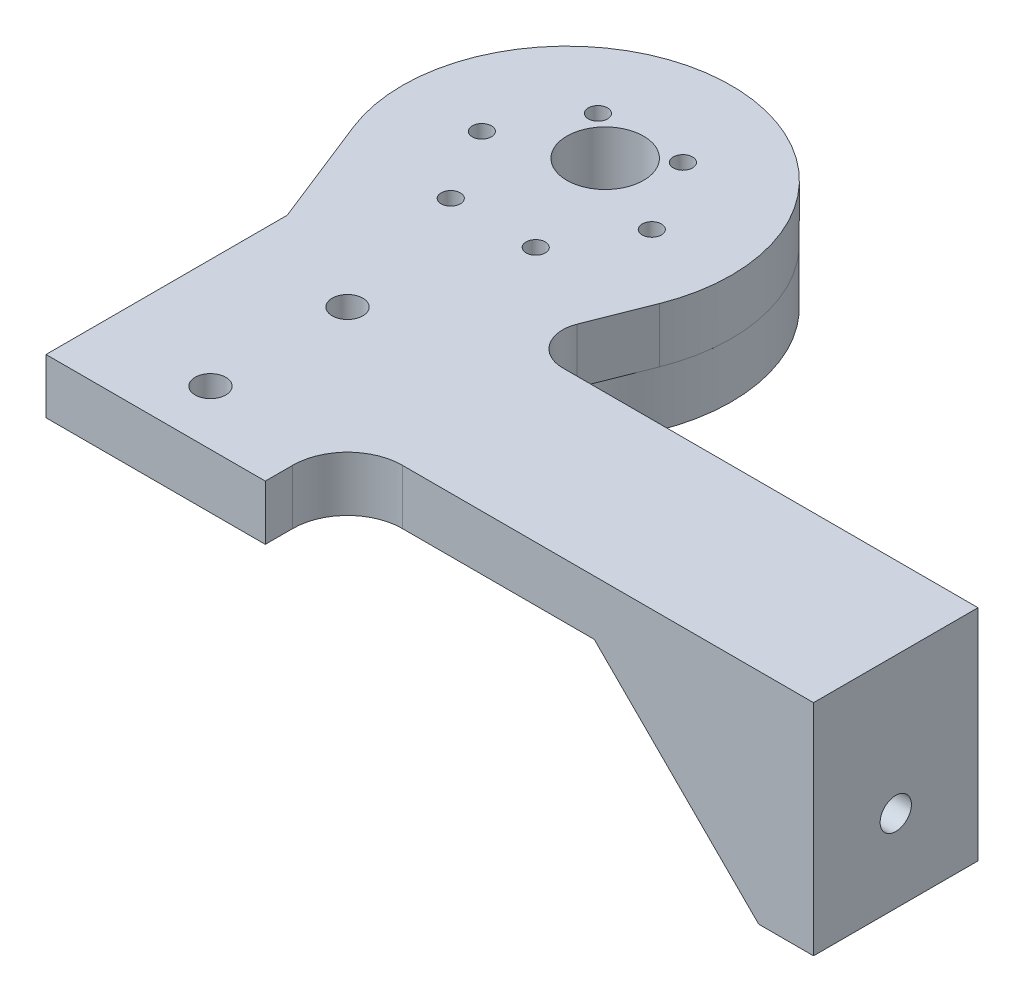
ISO-10303-21;
HEADER;
FILE_DESCRIPTION(('STEP AP214'),'2;1');
FILE_NAME('part.step','',(''),(''),'','','');
FILE_SCHEMA(('AUTOMOTIVE_DESIGN { 1 0 10303 214 1 1 1 1 }'));
ENDSEC;
DATA;
#1=APPLICATION_CONTEXT('core data for automotive mechanical design processes');
#2=APPLICATION_PROTOCOL_DEFINITION('international standard','automotive_design',2000,#1);
#3=PRODUCT_CONTEXT('',#1,'mechanical');
#4=PRODUCT('Part','Part','',(#3));
#5=PRODUCT_RELATED_PRODUCT_CATEGORY('part','',(#4));
#6=PRODUCT_DEFINITION_FORMATION('','',#4);
#7=PRODUCT_DEFINITION_CONTEXT('part definition',#1,'design');
#8=PRODUCT_DEFINITION('design','',#6,#7);
#9=PRODUCT_DEFINITION_SHAPE('','',#8);
#10=(LENGTH_UNIT() NAMED_UNIT(*) SI_UNIT(.MILLI.,.METRE.));
#11=(NAMED_UNIT(*) PLANE_ANGLE_UNIT() SI_UNIT($,.RADIAN.));
#12=(NAMED_UNIT(*) SI_UNIT($,.STERADIAN.) SOLID_ANGLE_UNIT());
#13=UNCERTAINTY_MEASURE_WITH_UNIT(LENGTH_MEASURE(1.E-05),#10,'distance_accuracy_value','');
#14=(GEOMETRIC_REPRESENTATION_CONTEXT(3) GLOBAL_UNCERTAINTY_ASSIGNED_CONTEXT((#13)) GLOBAL_UNIT_ASSIGNED_CONTEXT((#10,
#11,#12)) REPRESENTATION_CONTEXT('',''));
#15=CARTESIAN_POINT('',(0.,0.,0.));
#16=DIRECTION('',(0.,0.,1.));
#17=DIRECTION('',(1.,0.,0.));
#18=AXIS2_PLACEMENT_3D('',#15,#16,#17);
#19=CARTESIAN_POINT('',(0.,0.,0.));
#20=DIRECTION('',(0.,1.,0.));
#21=DIRECTION('',(0.,0.,1.));
#22=AXIS2_PLACEMENT_3D('',#19,#20,#21);
#23=PLANE('',#22);
#24=CARTESIAN_POINT('',(0.,0.,29.));
#25=DIRECTION('',(0.,1.,0.));
#26=DIRECTION('',(0.,0.,1.));
#27=AXIS2_PLACEMENT_3D('',#24,#25,#26);
#28=CIRCLE('',#27,5.3);
#29=CARTESIAN_POINT('',(0.,0.,34.3));
#30=VERTEX_POINT('',#29);
#31=EDGE_CURVE('E50',#30,#30,#28,.T.);
#32=ORIENTED_EDGE('',*,*,#31,.T.);
#33=EDGE_LOOP('',(#32));
#34=FACE_BOUND('',#33,.T.);
#35=CARTESIAN_POINT('',(0.,0.,4.));
#36=DIRECTION('',(0.,1.,0.));
#37=DIRECTION('',(0.,0.,1.));
#38=AXIS2_PLACEMENT_3D('',#35,#36,#37);
#39=CIRCLE('',#38,5.30000000000001);
#40=CARTESIAN_POINT('',(0.,0.,9.30000000000001));
#41=VERTEX_POINT('',#40);
#42=EDGE_CURVE('E465',#41,#41,#39,.T.);
#43=ORIENTED_EDGE('',*,*,#42,.T.);
#44=EDGE_LOOP('',(#43));
#45=FACE_BOUND('',#44,.T.);
#46=DIRECTION('',(0.,0.,1.));
#47=VECTOR('',#46,1.);
#48=CARTESIAN_POINT('',(65.,0.,19.));
#49=LINE('',#48,#47);
#50=CARTESIAN_POINT('',(65.,0.,19.));
#51=VERTEX_POINT('',#50);
#52=CARTESIAN_POINT('',(65.,0.,24.));
#53=VERTEX_POINT('',#52);
#54=EDGE_CURVE('E192',#51,#53,#49,.T.);
#55=ORIENTED_EDGE('',*,*,#54,.T.);
#56=DIRECTION('',(1.,0.,0.));
#57=VECTOR('',#56,1.);
#58=CARTESIAN_POINT('',(91.4644660940673,0.,24.));
#59=LINE('',#58,#57);
#60=CARTESIAN_POINT('',(30.,0.,24.));
#61=VERTEX_POINT('',#60);
#62=EDGE_CURVE('E587',#61,#53,#59,.T.);
#63=ORIENTED_EDGE('',*,*,#62,.F.);
#64=CARTESIAN_POINT('',(30.,0.,34.));
#65=DIRECTION('',(0.,1.,0.));
#66=DIRECTION('',(0.,0.,1.));
#67=AXIS2_PLACEMENT_3D('',#64,#65,#66);
#68=CIRCLE('',#67,10.);
#69=CARTESIAN_POINT('',(20.,0.,34.));
#70=VERTEX_POINT('',#69);
#71=EDGE_CURVE('E558',#61,#70,#68,.T.);
#72=ORIENTED_EDGE('',*,*,#71,.T.);
#73=DIRECTION('',(0.,0.,1.));
#74=VECTOR('',#73,1.);
#75=CARTESIAN_POINT('',(20.,0.,0.));
#76=LINE('',#75,#74);
#77=CARTESIAN_POINT('',(20.,0.,39.));
#78=VERTEX_POINT('',#77);
#79=EDGE_CURVE('E293',#70,#78,#76,.T.);
#80=ORIENTED_EDGE('',*,*,#79,.T.);
#81=DIRECTION('',(1.,0.,0.));
#82=VECTOR('',#81,1.);
#83=CARTESIAN_POINT('',(0.,0.,39.));
#84=LINE('',#83,#82);
#85=CARTESIAN_POINT('',(-20.,0.,39.));
#86=VERTEX_POINT('',#85);
#87=EDGE_CURVE('E290',#86,#78,#84,.T.);
#88=ORIENTED_EDGE('',*,*,#87,.F.);
#89=DIRECTION('',(0.,0.,1.));
#90=VECTOR('',#89,1.);
#91=CARTESIAN_POINT('',(-20.,0.,0.));
#92=LINE('',#91,#90);
#93=CARTESIAN_POINT('',(-20.,0.,-4.99999999999999));
#94=VERTEX_POINT('',#93);
#95=EDGE_CURVE('E287',#94,#86,#92,.T.);
#96=ORIENTED_EDGE('',*,*,#95,.F.);
#97=DIRECTION('',(0.367810603399802,0.,0.929900725898563));
#98=VECTOR('',#97,1.);
#99=CARTESIAN_POINT('',(-15.5841704650602,0.,6.16412374202665));
#100=LINE('',#99,#98);
#101=CARTESIAN_POINT('',(-27.881168443412,0.,-24.9252120213934));
#102=VERTEX_POINT('',#101);
#103=EDGE_CURVE('E288',#102,#94,#100,.T.);
#104=ORIENTED_EDGE('',*,*,#103,.F.);
#105=CARTESIAN_POINT('',(-0.000109724846624294,0.,-35.9998029723905));
#106=DIRECTION('',(0.,-1.,0.));
#107=DIRECTION('',(0.,0.,-1.));
#108=AXIS2_PLACEMENT_3D('',#105,#106,#107);
#109=CIRCLE('',#108,30.);
#110=CARTESIAN_POINT('',(27.8716982193593,0.,-24.9019508414015));
#111=VERTEX_POINT('',#110);
#112=EDGE_CURVE('E226',#111,#102,#109,.T.);
#113=ORIENTED_EDGE('',*,*,#112,.F.);
#114=DIRECTION('',(-0.367810603399802,0.,0.929900725898563));
#115=VECTOR('',#114,1.);
#116=CARTESIAN_POINT('',(15.5839373765418,0.,6.16403154677807));
#117=LINE('',#116,#115);
#118=CARTESIAN_POINT('',(23.641390214847,0.,-14.2068636203988));
#119=VERTEX_POINT('',#118);
#120=EDGE_CURVE('E295',#111,#119,#117,.T.);
#121=ORIENTED_EDGE('',*,*,#120,.T.);
#122=CARTESIAN_POINT('',(29.2207945702384,0.,-12.));
#123=DIRECTION('',(0.,1.,0.));
#124=DIRECTION('',(0.,0.,1.));
#125=AXIS2_PLACEMENT_3D('',#122,#123,#124);
#126=CIRCLE('',#125,6.);
#127=CARTESIAN_POINT('',(29.2207945702384,0.,-6.));
#128=VERTEX_POINT('',#127);
#129=EDGE_CURVE('E460',#119,#128,#126,.T.);
#130=ORIENTED_EDGE('',*,*,#129,.T.);
#131=DIRECTION('',(1.,0.,0.));
#132=VECTOR('',#131,1.);
#133=CARTESIAN_POINT('',(91.4644660940673,0.,-6.));
#134=LINE('',#133,#132);
#135=CARTESIAN_POINT('',(65.,0.,-6.));
#136=VERTEX_POINT('',#135);
#137=EDGE_CURVE('E576',#128,#136,#134,.T.);
#138=ORIENTED_EDGE('',*,*,#137,.T.);
#139=DIRECTION('',(0.,0.,-1.));
#140=VECTOR('',#139,1.);
#141=CARTESIAN_POINT('',(65.,0.,-0.999999999999998));
#142=LINE('',#141,#140);
#143=CARTESIAN_POINT('',(65.,0.,-0.999999999999998));
#144=VERTEX_POINT('',#143);
#145=EDGE_CURVE('E57',#144,#136,#142,.T.);
#146=ORIENTED_EDGE('',*,*,#145,.F.);
#147=DIRECTION('',(1.,0.,0.));
#148=VECTOR('',#147,1.);
#149=CARTESIAN_POINT('',(95.,1.03649727689614E-13,-0.999999999999998));
#150=LINE('',#149,#148);
#151=CARTESIAN_POINT('',(91.4644660940673,0.,-0.999999999999997));
#152=VERTEX_POINT('',#151);
#153=EDGE_CURVE('E619',#144,#152,#150,.T.);
#154=ORIENTED_EDGE('',*,*,#153,.T.);
#155=DIRECTION('',(0.,0.,-1.));
#156=VECTOR('',#155,1.);
#157=CARTESIAN_POINT('',(91.4644660940673,0.,24.));
#158=LINE('',#157,#156);
#159=CARTESIAN_POINT('',(91.4644660940672,0.,19.));
#160=VERTEX_POINT('',#159);
#161=EDGE_CURVE('E65',#160,#152,#158,.T.);
#162=ORIENTED_EDGE('',*,*,#161,.F.);
#163=DIRECTION('',(1.,0.,0.));
#164=VECTOR('',#163,1.);
#165=CARTESIAN_POINT('',(95.,1.03649727689614E-13,19.));
#166=LINE('',#165,#164);
#167=EDGE_CURVE('E183',#51,#160,#166,.T.);
#168=ORIENTED_EDGE('',*,*,#167,.F.);
#169=EDGE_LOOP('',(#55,#63,#72,#80,#88,#96,#104,#113,#121,#130,#138,#146,#154,#162,#168));
#170=FACE_BOUND('',#169,.T.);
#171=ADVANCED_FACE('F41',(#34,#45,#170),#23,.F.);
#172=CARTESIAN_POINT('',(20.,10.,0.));
#173=DIRECTION('',(1.,0.,0.));
#174=DIRECTION('',(0.,0.,-1.));
#175=AXIS2_PLACEMENT_3D('',#172,#173,#174);
#176=PLANE('',#175);
#177=ORIENTED_EDGE('',*,*,#79,.F.);
#178=DIRECTION('',(0.,-1.,0.));
#179=VECTOR('',#178,1.);
#180=CARTESIAN_POINT('',(20.,10.,34.));
#181=LINE('',#180,#179);
#182=CARTESIAN_POINT('',(20.,10.,34.));
#183=VERTEX_POINT('',#182);
#184=EDGE_CURVE('E561',#70,#183,#181,.F.);
#185=ORIENTED_EDGE('',*,*,#184,.T.);
#186=DIRECTION('',(0.,0.,1.));
#187=VECTOR('',#186,1.);
#188=CARTESIAN_POINT('',(20.,10.,0.));
#189=LINE('',#188,#187);
#190=CARTESIAN_POINT('',(20.,10.,39.));
#191=VERTEX_POINT('',#190);
#192=EDGE_CURVE('E251',#183,#191,#189,.T.);
#193=ORIENTED_EDGE('',*,*,#192,.T.);
#194=DIRECTION('',(0.,-1.,0.));
#195=VECTOR('',#194,1.);
#196=CARTESIAN_POINT('',(20.,10.,39.));
#197=LINE('',#196,#195);
#198=EDGE_CURVE('E320',#191,#78,#197,.T.);
#199=ORIENTED_EDGE('',*,*,#198,.T.);
#200=EDGE_LOOP('',(#177,#185,#193,#199));
#201=FACE_BOUND('',#200,.T.);
#202=ADVANCED_FACE('F382',(#201),#176,.T.);
#203=CARTESIAN_POINT('',(0.,0.,-42.9998029715306));
#204=DIRECTION('',(0.,1.,0.));
#205=DIRECTION('',(0.,0.,1.));
#206=AXIS2_PLACEMENT_3D('',#203,#204,#205);
#207=CIRCLE('',#206,7.);
#208=CARTESIAN_POINT('',(0.,0.,-35.9998029715306));
#209=VERTEX_POINT('',#208);
#210=EDGE_CURVE('E244',#209,#209,#207,.T.);
#211=ORIENTED_EDGE('',*,*,#210,.T.);
#212=EDGE_LOOP('',(#211));
#213=FACE_BOUND('',#212,.T.);
#214=CARTESIAN_POINT('',(15.4999268338223,0.,-35.999990172644));
#215=DIRECTION('',(0.,1.,0.));
#216=DIRECTION('',(0.,0.,1.));
#217=AXIS2_PLACEMENT_3D('',#214,#215,#216);
#218=CIRCLE('',#217,1.74999999984744);
#219=CARTESIAN_POINT('',(15.4999268338223,0.,-34.2499901727966));
#220=VERTEX_POINT('',#219);
#221=EDGE_CURVE('E314',#220,#220,#218,.T.);
#222=ORIENTED_EDGE('',*,*,#221,.T.);
#223=EDGE_LOOP('',(#222));
#224=FACE_BOUND('',#223,.T.);
#225=CARTESIAN_POINT('',(7.74993934954525,0.,-22.576589188037));
#226=DIRECTION('',(0.,1.,0.));
#227=DIRECTION('',(0.,0.,1.));
#228=AXIS2_PLACEMENT_3D('',#225,#226,#227);
#229=CIRCLE('',#228,1.74999999984744);
#230=CARTESIAN_POINT('',(7.74993934954525,0.,-20.8265891881896));
#231=VERTEX_POINT('',#230);
#232=EDGE_CURVE('E311',#231,#231,#229,.T.);
#233=ORIENTED_EDGE('',*,*,#232,.T.);
#234=EDGE_LOOP('',(#233));
#235=FACE_BOUND('',#234,.T.);
#236=CARTESIAN_POINT('',(-7.75006065044802,0.,-22.5765747361289));
#237=DIRECTION('',(0.,1.,0.));
#238=DIRECTION('',(0.,0.,1.));
#239=AXIS2_PLACEMENT_3D('',#236,#237,#238);
#240=CIRCLE('',#239,1.74999999984744);
#241=CARTESIAN_POINT('',(-7.75006065044802,0.,-20.8265747362815));
#242=VERTEX_POINT('',#241);
#243=EDGE_CURVE('E308',#242,#242,#240,.T.);
#244=ORIENTED_EDGE('',*,*,#243,.T.);
#245=EDGE_LOOP('',(#244));
#246=FACE_BOUND('',#245,.T.);
#247=CARTESIAN_POINT('',(-15.5000731661642,0.,-35.9999612688279));
#248=DIRECTION('',(0.,1.,0.));
#249=DIRECTION('',(0.,0.,1.));
#250=AXIS2_PLACEMENT_3D('',#247,#248,#249);
#251=CIRCLE('',#250,1.74999999984744);
#252=CARTESIAN_POINT('',(-15.5000731661642,0.,-34.2499612689804));
#253=VERTEX_POINT('',#252);
#254=EDGE_CURVE('E305',#253,#253,#251,.T.);
#255=ORIENTED_EDGE('',*,*,#254,.T.);
#256=EDGE_LOOP('',(#255));
#257=FACE_BOUND('',#256,.T.);
#258=CARTESIAN_POINT('',(-7.75008568188708,0.,-49.4233622534349));
#259=DIRECTION('',(0.,1.,0.));
#260=DIRECTION('',(0.,0.,1.));
#261=AXIS2_PLACEMENT_3D('',#258,#259,#260);
#262=CIRCLE('',#261,1.74999999984745);
#263=CARTESIAN_POINT('',(-7.75008568188708,0.,-47.6733622535874));
#264=VERTEX_POINT('',#263);
#265=EDGE_CURVE('E302',#264,#264,#262,.T.);
#266=ORIENTED_EDGE('',*,*,#265,.T.);
#267=EDGE_LOOP('',(#266));
#268=FACE_BOUND('',#267,.T.);
#269=CARTESIAN_POINT('',(7.74991431810619,0.,-49.423376705343));
#270=DIRECTION('',(0.,1.,0.));
#271=DIRECTION('',(0.,0.,1.));
#272=AXIS2_PLACEMENT_3D('',#269,#270,#271);
#273=CIRCLE('',#272,1.74999999984744);
#274=CARTESIAN_POINT('',(7.74991431810619,0.,-47.6733767054955));
#275=VERTEX_POINT('',#274);
#276=EDGE_CURVE('E299',#275,#275,#273,.T.);
#277=ORIENTED_EDGE('',*,*,#276,.T.);
#278=EDGE_LOOP('',(#277));
#279=FACE_BOUND('',#278,.T.);
#280=CARTESIAN_POINT('',(-0.000109724846624294,0.,-35.9998029723905));
#281=DIRECTION('',(0.,-1.,0.));
#282=DIRECTION('',(0.,0.,-1.));
#283=AXIS2_PLACEMENT_3D('',#280,#281,#282);
#284=CIRCLE('',#283,18.7);
#285=CARTESIAN_POINT('',(-0.000109724846624294,0.,-54.6998029723906));
#286=VERTEX_POINT('',#285);
#287=EDGE_CURVE('E214',#286,#286,#284,.T.);
#288=ORIENTED_EDGE('',*,*,#287,.T.);
#289=EDGE_LOOP('',(#288));
#290=FACE_BOUND('',#289,.T.);
#291=ADVANCED_FACE('F356',(#213,#224,#235,#246,#257,#268,#279,#290),#23,.F.);
#292=CARTESIAN_POINT('',(-0.000134777597993532,10.,-35.9999513511064));
#293=DIRECTION('',(0.,-1.,0.));
#294=DIRECTION('',(0.,0.,-1.));
#295=AXIS2_PLACEMENT_3D('',#292,#293,#294);
#296=CYLINDRICAL_SURFACE('',#295,30.);
#297=CARTESIAN_POINT('',(-0.000134777597993532,0.,-35.9999513511064));
#298=DIRECTION('',(0.,1.,0.));
#299=DIRECTION('',(0.,0.,1.));
#300=AXIS2_PLACEMENT_3D('',#297,#298,#299);
#301=CIRCLE('',#300,30.);
#302=CARTESIAN_POINT('',(-27.8971565545549,0.,-24.9656332491124));
#303=VERTEX_POINT('',#302);
#304=CARTESIAN_POINT('',(-29.5814324307801,0.,-31.0052712658716));
#305=VERTEX_POINT('',#304);
#306=EDGE_CURVE('E331',#303,#305,#301,.F.);
#307=ORIENTED_EDGE('',*,*,#306,.F.);
#308=DIRECTION('',(0.,-1.,0.));
#309=VECTOR('',#308,1.);
#310=CARTESIAN_POINT('',(-27.8971565545549,10.,-24.9656332491124));
#311=LINE('',#310,#309);
#312=CARTESIAN_POINT('',(-27.8971565545549,10.,-24.9656332491124));
#313=VERTEX_POINT('',#312);
#314=EDGE_CURVE('E329',#313,#303,#311,.T.);
#315=ORIENTED_EDGE('',*,*,#314,.F.);
#316=CARTESIAN_POINT('',(-0.000134777597993532,10.,-35.9999513511064));
#317=DIRECTION('',(0.,1.,0.));
#318=DIRECTION('',(0.,0.,1.));
#319=AXIS2_PLACEMENT_3D('',#316,#317,#318);
#320=CIRCLE('',#319,30.);
#321=CARTESIAN_POINT('',(27.8968869993589,10.,-24.9656332491124));
#322=VERTEX_POINT('',#321);
#323=EDGE_CURVE('E240',#313,#322,#320,.F.);
#324=ORIENTED_EDGE('',*,*,#323,.T.);
#325=DIRECTION('',(0.,-1.,0.));
#326=VECTOR('',#325,1.);
#327=CARTESIAN_POINT('',(27.8968869993589,10.,-24.9656332491124));
#328=LINE('',#327,#326);
#329=CARTESIAN_POINT('',(27.8968869993589,0.,-24.9656332491124));
#330=VERTEX_POINT('',#329);
#331=EDGE_CURVE('E283',#322,#330,#328,.T.);
#332=ORIENTED_EDGE('',*,*,#331,.T.);
#333=CARTESIAN_POINT('',(29.5811879285658,0.,-40.9944830562613));
#334=VERTEX_POINT('',#333);
#335=EDGE_CURVE('E224',#334,#330,#301,.F.);
#336=ORIENTED_EDGE('',*,*,#335,.F.);
#337=CARTESIAN_POINT('',(-0.000109724846624294,0.,-35.9998029723905));
#338=DIRECTION('',(0.,-1.,0.));
#339=DIRECTION('',(-0.986044090197783,0.,0.166484390217298));
#340=AXIS2_PLACEMENT_3D('',#337,#338,#339);
#341=CIRCLE('',#340,30.);
#342=EDGE_CURVE('E231',#305,#334,#341,.T.);
#343=ORIENTED_EDGE('',*,*,#342,.F.);
#344=EDGE_LOOP('',(#307,#315,#324,#332,#336,#343));
#345=FACE_BOUND('',#344,.T.);
#346=ADVANCED_FACE('F345',(#345),#296,.T.);
#347=CARTESIAN_POINT('',(-15.5841704650602,10.,6.16412374202665));
#348=DIRECTION('',(0.929900725898563,0.,-0.367810603399802));
#349=DIRECTION('',(-0.367810603399802,0.,-0.929900725898563));
#350=AXIS2_PLACEMENT_3D('',#347,#348,#349);
#351=PLANE('',#350);
#352=EDGE_CURVE('E284',#303,#102,#100,.T.);
#353=ORIENTED_EDGE('',*,*,#352,.T.);
#354=ORIENTED_EDGE('',*,*,#103,.T.);
#355=DIRECTION('',(0.,-1.,0.));
#356=VECTOR('',#355,1.);
#357=CARTESIAN_POINT('',(-20.,10.,-4.99999999999999));
#358=LINE('',#357,#356);
#359=CARTESIAN_POINT('',(-20.,10.,-4.99999999999999));
#360=VERTEX_POINT('',#359);
#361=EDGE_CURVE('E326',#360,#94,#358,.T.);
#362=ORIENTED_EDGE('',*,*,#361,.F.);
#363=DIRECTION('',(0.367810603399802,0.,0.929900725898563));
#364=VECTOR('',#363,1.);
#365=CARTESIAN_POINT('',(-15.5841704650602,10.,6.16412374202665));
#366=LINE('',#365,#364);
#367=EDGE_CURVE('E243',#313,#360,#366,.T.);
#368=ORIENTED_EDGE('',*,*,#367,.F.);
#369=ORIENTED_EDGE('',*,*,#314,.T.);
#370=EDGE_LOOP('',(#353,#354,#362,#368,#369));
#371=FACE_BOUND('',#370,.T.);
#372=ADVANCED_FACE('F355',(#371),#351,.F.);
#373=CARTESIAN_POINT('',(-20.,10.,0.));
#374=DIRECTION('',(1.,0.,0.));
#375=DIRECTION('',(0.,0.,-1.));
#376=AXIS2_PLACEMENT_3D('',#373,#374,#375);
#377=PLANE('',#376);
#378=ORIENTED_EDGE('',*,*,#95,.T.);
#379=DIRECTION('',(0.,-1.,0.));
#380=VECTOR('',#379,1.);
#381=CARTESIAN_POINT('',(-20.,10.,39.));
#382=LINE('',#381,#380);
#383=CARTESIAN_POINT('',(-20.,10.,39.));
#384=VERTEX_POINT('',#383);
#385=EDGE_CURVE('E323',#384,#86,#382,.T.);
#386=ORIENTED_EDGE('',*,*,#385,.F.);
#387=DIRECTION('',(0.,0.,1.));
#388=VECTOR('',#387,1.);
#389=CARTESIAN_POINT('',(-20.,10.,0.));
#390=LINE('',#389,#388);
#391=EDGE_CURVE('E246',#360,#384,#390,.T.);
#392=ORIENTED_EDGE('',*,*,#391,.F.);
#393=ORIENTED_EDGE('',*,*,#361,.T.);
#394=EDGE_LOOP('',(#378,#386,#392,#393));
#395=FACE_BOUND('',#394,.T.);
#396=ADVANCED_FACE('F541',(#395),#377,.F.);
#397=CARTESIAN_POINT('',(0.,10.,39.));
#398=DIRECTION('',(0.,0.,-1.));
#399=DIRECTION('',(-1.,0.,0.));
#400=AXIS2_PLACEMENT_3D('',#397,#398,#399);
#401=PLANE('',#400);
#402=ORIENTED_EDGE('',*,*,#87,.T.);
#403=ORIENTED_EDGE('',*,*,#198,.F.);
#404=DIRECTION('',(1.,0.,0.));
#405=VECTOR('',#404,1.);
#406=CARTESIAN_POINT('',(0.,10.,39.));
#407=LINE('',#406,#405);
#408=EDGE_CURVE('E248',#384,#191,#407,.T.);
#409=ORIENTED_EDGE('',*,*,#408,.F.);
#410=ORIENTED_EDGE('',*,*,#385,.T.);
#411=EDGE_LOOP('',(#402,#403,#409,#410));
#412=FACE_BOUND('',#411,.T.);
#413=ADVANCED_FACE('F516',(#412),#401,.F.);
#414=CARTESIAN_POINT('',(0.,10.,-42.9998029715306));
#415=DIRECTION('',(0.,-1.,0.));
#416=DIRECTION('',(0.,0.,-1.));
#417=AXIS2_PLACEMENT_3D('',#414,#415,#416);
#418=CYLINDRICAL_SURFACE('',#417,7.);
#419=CARTESIAN_POINT('',(0.,10.,-42.9998029715306));
#420=DIRECTION('',(0.,1.,0.));
#421=DIRECTION('',(0.,0.,1.));
#422=AXIS2_PLACEMENT_3D('',#419,#420,#421);
#423=CIRCLE('',#422,7.);
#424=CARTESIAN_POINT('',(0.,10.,-35.9998029715306));
#425=VERTEX_POINT('',#424);
#426=EDGE_CURVE('E277',#425,#425,#423,.T.);
#427=ORIENTED_EDGE('',*,*,#426,.T.);
#428=EDGE_LOOP('',(#427));
#429=FACE_BOUND('',#428,.T.);
#430=ORIENTED_EDGE('',*,*,#210,.F.);
#431=EDGE_LOOP('',(#430));
#432=FACE_BOUND('',#431,.T.);
#433=ADVANCED_FACE('F512',(#429,#432),#418,.F.);
#434=CARTESIAN_POINT('',(15.4999268338223,10.,-35.999990172644));
#435=DIRECTION('',(0.,-1.,0.));
#436=DIRECTION('',(0.,0.,-1.));
#437=AXIS2_PLACEMENT_3D('',#434,#435,#436);
#438=CYLINDRICAL_SURFACE('',#437,1.74999999984744);
#439=CARTESIAN_POINT('',(15.4999268338223,10.,-35.999990172644));
#440=DIRECTION('',(0.,1.,0.));
#441=DIRECTION('',(0.,0.,1.));
#442=AXIS2_PLACEMENT_3D('',#439,#440,#441);
#443=CIRCLE('',#442,1.74999999984744);
#444=CARTESIAN_POINT('',(15.4999268338223,10.,-34.2499901727966));
#445=VERTEX_POINT('',#444);
#446=EDGE_CURVE('E274',#445,#445,#443,.T.);
#447=ORIENTED_EDGE('',*,*,#446,.T.);
#448=EDGE_LOOP('',(#447));
#449=FACE_BOUND('',#448,.T.);
#450=ORIENTED_EDGE('',*,*,#221,.F.);
#451=EDGE_LOOP('',(#450));
#452=FACE_BOUND('',#451,.T.);
#453=ADVANCED_FACE('F515',(#449,#452),#438,.F.);
#454=CARTESIAN_POINT('',(7.74993934954525,10.,-22.576589188037));
#455=DIRECTION('',(0.,-1.,0.));
#456=DIRECTION('',(0.,0.,-1.));
#457=AXIS2_PLACEMENT_3D('',#454,#455,#456);
#458=CYLINDRICAL_SURFACE('',#457,1.74999999984744);
#459=CARTESIAN_POINT('',(7.74993934954525,10.,-22.576589188037));
#460=DIRECTION('',(0.,1.,0.));
#461=DIRECTION('',(0.,0.,1.));
#462=AXIS2_PLACEMENT_3D('',#459,#460,#461);
#463=CIRCLE('',#462,1.74999999984744);
#464=CARTESIAN_POINT('',(7.74993934954525,10.,-20.8265891881896));
#465=VERTEX_POINT('',#464);
#466=EDGE_CURVE('E271',#465,#465,#463,.T.);
#467=ORIENTED_EDGE('',*,*,#466,.T.);
#468=EDGE_LOOP('',(#467));
#469=FACE_BOUND('',#468,.T.);
#470=ORIENTED_EDGE('',*,*,#232,.F.);
#471=EDGE_LOOP('',(#470));
#472=FACE_BOUND('',#471,.T.);
#473=ADVANCED_FACE('F520',(#469,#472),#458,.F.);
#474=CARTESIAN_POINT('',(-7.75006065044802,10.,-22.5765747361289));
#475=DIRECTION('',(0.,-1.,0.));
#476=DIRECTION('',(0.,0.,-1.));
#477=AXIS2_PLACEMENT_3D('',#474,#475,#476);
#478=CYLINDRICAL_SURFACE('',#477,1.74999999984744);
#479=CARTESIAN_POINT('',(-7.75006065044802,10.,-22.5765747361289));
#480=DIRECTION('',(0.,1.,0.));
#481=DIRECTION('',(0.,0.,1.));
#482=AXIS2_PLACEMENT_3D('',#479,#480,#481);
#483=CIRCLE('',#482,1.74999999984744);
#484=CARTESIAN_POINT('',(-7.75006065044802,10.,-20.8265747362815));
#485=VERTEX_POINT('',#484);
#486=EDGE_CURVE('E268',#485,#485,#483,.T.);
#487=ORIENTED_EDGE('',*,*,#486,.T.);
#488=EDGE_LOOP('',(#487));
#489=FACE_BOUND('',#488,.T.);
#490=ORIENTED_EDGE('',*,*,#243,.F.);
#491=EDGE_LOOP('',(#490));
#492=FACE_BOUND('',#491,.T.);
#493=ADVANCED_FACE('F524',(#489,#492),#478,.F.);
#494=CARTESIAN_POINT('',(-15.5000731661642,10.,-35.9999612688279));
#495=DIRECTION('',(0.,-1.,0.));
#496=DIRECTION('',(0.,0.,-1.));
#497=AXIS2_PLACEMENT_3D('',#494,#495,#496);
#498=CYLINDRICAL_SURFACE('',#497,1.74999999984744);
#499=CARTESIAN_POINT('',(-15.5000731661642,10.,-35.9999612688279));
#500=DIRECTION('',(0.,1.,0.));
#501=DIRECTION('',(0.,0.,1.));
#502=AXIS2_PLACEMENT_3D('',#499,#500,#501);
#503=CIRCLE('',#502,1.74999999984744);
#504=CARTESIAN_POINT('',(-15.5000731661642,10.,-34.2499612689804));
#505=VERTEX_POINT('',#504);
#506=EDGE_CURVE('E265',#505,#505,#503,.T.);
#507=ORIENTED_EDGE('',*,*,#506,.T.);
#508=EDGE_LOOP('',(#507));
#509=FACE_BOUND('',#508,.T.);
#510=ORIENTED_EDGE('',*,*,#254,.F.);
#511=EDGE_LOOP('',(#510));
#512=FACE_BOUND('',#511,.T.);
#513=ADVANCED_FACE('F528',(#509,#512),#498,.F.);
#514=CARTESIAN_POINT('',(-7.75008568188708,10.,-49.4233622534349));
#515=DIRECTION('',(0.,-1.,0.));
#516=DIRECTION('',(0.,0.,-1.));
#517=AXIS2_PLACEMENT_3D('',#514,#515,#516);
#518=CYLINDRICAL_SURFACE('',#517,1.74999999984745);
#519=CARTESIAN_POINT('',(-7.75008568188708,10.,-49.4233622534349));
#520=DIRECTION('',(0.,1.,0.));
#521=DIRECTION('',(0.,0.,1.));
#522=AXIS2_PLACEMENT_3D('',#519,#520,#521);
#523=CIRCLE('',#522,1.74999999984745);
#524=CARTESIAN_POINT('',(-7.75008568188708,10.,-47.6733622535874));
#525=VERTEX_POINT('',#524);
#526=EDGE_CURVE('E262',#525,#525,#523,.T.);
#527=ORIENTED_EDGE('',*,*,#526,.T.);
#528=EDGE_LOOP('',(#527));
#529=FACE_BOUND('',#528,.T.);
#530=ORIENTED_EDGE('',*,*,#265,.F.);
#531=EDGE_LOOP('',(#530));
#532=FACE_BOUND('',#531,.T.);
#533=ADVANCED_FACE('F532',(#529,#532),#518,.F.);
#534=CARTESIAN_POINT('',(7.74991431810619,10.,-49.423376705343));
#535=DIRECTION('',(0.,-1.,0.));
#536=DIRECTION('',(0.,0.,-1.));
#537=AXIS2_PLACEMENT_3D('',#534,#535,#536);
#538=CYLINDRICAL_SURFACE('',#537,1.74999999984744);
#539=CARTESIAN_POINT('',(7.74991431810619,10.,-49.423376705343));
#540=DIRECTION('',(0.,1.,0.));
#541=DIRECTION('',(0.,0.,1.));
#542=AXIS2_PLACEMENT_3D('',#539,#540,#541);
#543=CIRCLE('',#542,1.74999999984744);
#544=CARTESIAN_POINT('',(7.74991431810619,10.,-47.6733767054955));
#545=VERTEX_POINT('',#544);
#546=EDGE_CURVE('E259',#545,#545,#543,.T.);
#547=ORIENTED_EDGE('',*,*,#546,.T.);
#548=EDGE_LOOP('',(#547));
#549=FACE_BOUND('',#548,.T.);
#550=ORIENTED_EDGE('',*,*,#276,.F.);
#551=EDGE_LOOP('',(#550));
#552=FACE_BOUND('',#551,.T.);
#553=ADVANCED_FACE('F481',(#549,#552),#538,.F.);
#554=CARTESIAN_POINT('',(0.,10.,4.));
#555=DIRECTION('',(0.,-1.,0.));
#556=DIRECTION('',(0.,0.,-1.));
#557=AXIS2_PLACEMENT_3D('',#554,#555,#556);
#558=CYLINDRICAL_SURFACE('',#557,2.8);
#559=CARTESIAN_POINT('',(0.,2.50000000000003,4.));
#560=DIRECTION('',(0.,1.,0.));
#561=DIRECTION('',(0.,0.,1.));
#562=AXIS2_PLACEMENT_3D('',#559,#560,#561);
#563=CIRCLE('',#562,2.8);
#564=CARTESIAN_POINT('',(0.,2.50000000000003,6.8));
#565=VERTEX_POINT('',#564);
#566=EDGE_CURVE('E469',#565,#565,#563,.F.);
#567=ORIENTED_EDGE('',*,*,#566,.T.);
#568=EDGE_LOOP('',(#567));
#569=FACE_BOUND('',#568,.T.);
#570=CARTESIAN_POINT('',(0.,10.,4.));
#571=DIRECTION('',(0.,1.,0.));
#572=DIRECTION('',(0.,0.,1.));
#573=AXIS2_PLACEMENT_3D('',#570,#571,#572);
#574=CIRCLE('',#573,2.8);
#575=CARTESIAN_POINT('',(0.,10.,6.8));
#576=VERTEX_POINT('',#575);
#577=EDGE_CURVE('E256',#576,#576,#574,.T.);
#578=ORIENTED_EDGE('',*,*,#577,.T.);
#579=EDGE_LOOP('',(#578));
#580=FACE_BOUND('',#579,.T.);
#581=ADVANCED_FACE('F478',(#569,#580),#558,.F.);
#582=CARTESIAN_POINT('',(15.5839373765418,10.,6.16403154677807));
#583=DIRECTION('',(0.929900725898563,0.,0.367810603399802));
#584=DIRECTION('',(0.367810603399802,0.,-0.929900725898563));
#585=AXIS2_PLACEMENT_3D('',#582,#583,#584);
#586=PLANE('',#585);
#587=DIRECTION('',(-0.367810603399802,0.,0.929900725898563));
#588=VECTOR('',#587,1.);
#589=CARTESIAN_POINT('',(15.5839373765418,10.,6.16403154677807));
#590=LINE('',#589,#588);
#591=CARTESIAN_POINT('',(23.641390214847,10.,-14.2068636203988));
#592=VERTEX_POINT('',#591);
#593=EDGE_CURVE('E253',#322,#592,#590,.T.);
#594=ORIENTED_EDGE('',*,*,#593,.T.);
#595=DIRECTION('',(0.,1.,0.));
#596=VECTOR('',#595,1.);
#597=CARTESIAN_POINT('',(23.641390214847,0.,-14.2068636203988));
#598=LINE('',#597,#596);
#599=EDGE_CURVE('E458',#592,#119,#598,.F.);
#600=ORIENTED_EDGE('',*,*,#599,.T.);
#601=ORIENTED_EDGE('',*,*,#120,.F.);
#602=EDGE_CURVE('E296',#330,#111,#117,.T.);
#603=ORIENTED_EDGE('',*,*,#602,.F.);
#604=ORIENTED_EDGE('',*,*,#331,.F.);
#605=EDGE_LOOP('',(#594,#600,#601,#603,#604));
#606=FACE_BOUND('',#605,.T.);
#607=ADVANCED_FACE('F455',(#606),#586,.T.);
#608=CARTESIAN_POINT('',(0.,10.,29.));
#609=DIRECTION('',(0.,-1.,0.));
#610=DIRECTION('',(0.,0.,-1.));
#611=AXIS2_PLACEMENT_3D('',#608,#609,#610);
#612=CYLINDRICAL_SURFACE('',#611,2.8);
#613=CARTESIAN_POINT('',(0.,2.50000000000001,29.));
#614=DIRECTION('',(0.,1.,0.));
#615=DIRECTION('',(0.,0.,1.));
#616=AXIS2_PLACEMENT_3D('',#613,#614,#615);
#617=CIRCLE('',#616,2.8);
#618=CARTESIAN_POINT('',(0.,2.50000000000001,31.8));
#619=VERTEX_POINT('',#618);
#620=EDGE_CURVE('E11',#619,#619,#617,.F.);
#621=ORIENTED_EDGE('',*,*,#620,.T.);
#622=EDGE_LOOP('',(#621));
#623=FACE_BOUND('',#622,.T.);
#624=CARTESIAN_POINT('',(0.,10.,29.));
#625=DIRECTION('',(0.,1.,0.));
#626=DIRECTION('',(0.,0.,1.));
#627=AXIS2_PLACEMENT_3D('',#624,#625,#626);
#628=CIRCLE('',#627,2.8);
#629=CARTESIAN_POINT('',(0.,10.,31.8));
#630=VERTEX_POINT('',#629);
#631=EDGE_CURVE('E280',#630,#630,#628,.T.);
#632=ORIENTED_EDGE('',*,*,#631,.T.);
#633=EDGE_LOOP('',(#632));
#634=FACE_BOUND('',#633,.T.);
#635=ADVANCED_FACE('F486',(#623,#634),#612,.F.);
#636=CARTESIAN_POINT('',(0.,10.,0.));
#637=DIRECTION('',(0.,1.,0.));
#638=DIRECTION('',(0.,0.,1.));
#639=AXIS2_PLACEMENT_3D('',#636,#637,#638);
#640=PLANE('',#639);
#641=ORIENTED_EDGE('',*,*,#192,.F.);
#642=CARTESIAN_POINT('',(30.,10.,34.));
#643=DIRECTION('',(0.,1.,0.));
#644=DIRECTION('',(0.,0.,1.));
#645=AXIS2_PLACEMENT_3D('',#642,#643,#644);
#646=CIRCLE('',#645,10.);
#647=CARTESIAN_POINT('',(30.,10.,24.));
#648=VERTEX_POINT('',#647);
#649=EDGE_CURVE('E577',#183,#648,#646,.F.);
#650=ORIENTED_EDGE('',*,*,#649,.T.);
#651=DIRECTION('',(-1.,0.,0.));
#652=VECTOR('',#651,1.);
#653=CARTESIAN_POINT('',(20.,10.,24.));
#654=LINE('',#653,#652);
#655=CARTESIAN_POINT('',(105.,10.,24.));
#656=VERTEX_POINT('',#655);
#657=EDGE_CURVE('E589',#656,#648,#654,.T.);
#658=ORIENTED_EDGE('',*,*,#657,.F.);
#659=DIRECTION('',(0.,0.,-1.));
#660=VECTOR('',#659,1.);
#661=CARTESIAN_POINT('',(105.,10.,24.));
#662=LINE('',#661,#660);
#663=CARTESIAN_POINT('',(105.,10.,-6.));
#664=VERTEX_POINT('',#663);
#665=EDGE_CURVE('E601',#656,#664,#662,.T.);
#666=ORIENTED_EDGE('',*,*,#665,.T.);
#667=DIRECTION('',(-1.,0.,0.));
#668=VECTOR('',#667,1.);
#669=CARTESIAN_POINT('',(20.,10.,-6.));
#670=LINE('',#669,#668);
#671=CARTESIAN_POINT('',(29.2207945702384,10.,-6.));
#672=VERTEX_POINT('',#671);
#673=EDGE_CURVE('E571',#664,#672,#670,.T.);
#674=ORIENTED_EDGE('',*,*,#673,.T.);
#675=CARTESIAN_POINT('',(29.2207945702384,10.,-12.));
#676=DIRECTION('',(0.,1.,0.));
#677=DIRECTION('',(0.,0.,1.));
#678=AXIS2_PLACEMENT_3D('',#675,#676,#677);
#679=CIRCLE('',#678,6.);
#680=EDGE_CURVE('E466',#672,#592,#679,.F.);
#681=ORIENTED_EDGE('',*,*,#680,.T.);
#682=ORIENTED_EDGE('',*,*,#593,.F.);
#683=ORIENTED_EDGE('',*,*,#323,.F.);
#684=ORIENTED_EDGE('',*,*,#367,.T.);
#685=ORIENTED_EDGE('',*,*,#391,.T.);
#686=ORIENTED_EDGE('',*,*,#408,.T.);
#687=EDGE_LOOP('',(#641,#650,#658,#666,#674,#681,#682,#683,#684,#685,#686));
#688=FACE_BOUND('',#687,.T.);
#689=ORIENTED_EDGE('',*,*,#577,.F.);
#690=EDGE_LOOP('',(#689));
#691=FACE_BOUND('',#690,.T.);
#692=ORIENTED_EDGE('',*,*,#546,.F.);
#693=EDGE_LOOP('',(#692));
#694=FACE_BOUND('',#693,.T.);
#695=ORIENTED_EDGE('',*,*,#526,.F.);
#696=EDGE_LOOP('',(#695));
#697=FACE_BOUND('',#696,.T.);
#698=ORIENTED_EDGE('',*,*,#506,.F.);
#699=EDGE_LOOP('',(#698));
#700=FACE_BOUND('',#699,.T.);
#701=ORIENTED_EDGE('',*,*,#486,.F.);
#702=EDGE_LOOP('',(#701));
#703=FACE_BOUND('',#702,.T.);
#704=ORIENTED_EDGE('',*,*,#466,.F.);
#705=EDGE_LOOP('',(#704));
#706=FACE_BOUND('',#705,.T.);
#707=ORIENTED_EDGE('',*,*,#446,.F.);
#708=EDGE_LOOP('',(#707));
#709=FACE_BOUND('',#708,.T.);
#710=ORIENTED_EDGE('',*,*,#426,.F.);
#711=EDGE_LOOP('',(#710));
#712=FACE_BOUND('',#711,.T.);
#713=ORIENTED_EDGE('',*,*,#631,.F.);
#714=EDGE_LOOP('',(#713));
#715=FACE_BOUND('',#714,.T.);
#716=ADVANCED_FACE('F438',(#688,#691,#694,#697,#700,#703,#706,#709,#712,#715),#640,.T.);
#717=CARTESIAN_POINT('',(-0.000109724846624294,0.,-35.9998029723905));
#718=DIRECTION('',(0.,-1.,0.));
#719=DIRECTION('',(0.,0.,-1.));
#720=AXIS2_PLACEMENT_3D('',#717,#718,#719);
#721=PLANE('',#720);
#722=EDGE_CURVE('E225',#334,#111,#109,.T.);
#723=ORIENTED_EDGE('',*,*,#722,.F.);
#724=ORIENTED_EDGE('',*,*,#335,.T.);
#725=ORIENTED_EDGE('',*,*,#602,.T.);
#726=EDGE_LOOP('',(#723,#724,#725));
#727=FACE_BOUND('',#726,.T.);
#728=ADVANCED_FACE('F436',(#727),#721,.F.);
#729=ORIENTED_EDGE('',*,*,#352,.F.);
#730=ORIENTED_EDGE('',*,*,#306,.T.);
#731=EDGE_CURVE('E218',#102,#305,#109,.T.);
#732=ORIENTED_EDGE('',*,*,#731,.F.);
#733=EDGE_LOOP('',(#729,#730,#732));
#734=FACE_BOUND('',#733,.T.);
#735=ADVANCED_FACE('F434',(#734),#721,.F.);
#736=CARTESIAN_POINT('',(-0.000109724846624294,-10.,-35.9998029723905));
#737=DIRECTION('',(0.,-1.,0.));
#738=DIRECTION('',(0.,0.,-1.));
#739=AXIS2_PLACEMENT_3D('',#736,#737,#738);
#740=PLANE('',#739);
#741=CARTESIAN_POINT('',(-0.000109724846624294,-10.,-35.9998029723905));
#742=DIRECTION('',(0.,-1.,0.));
#743=DIRECTION('',(0.,0.,-1.));
#744=AXIS2_PLACEMENT_3D('',#741,#742,#743);
#745=CIRCLE('',#744,30.);
#746=CARTESIAN_POINT('',(-0.000109724846624294,-10.,-65.9998029723906));
#747=VERTEX_POINT('',#746);
#748=EDGE_CURVE('E221',#747,#747,#745,.T.);
#749=ORIENTED_EDGE('',*,*,#748,.T.);
#750=EDGE_LOOP('',(#749));
#751=FACE_BOUND('',#750,.T.);
#752=CARTESIAN_POINT('',(-0.000109724846624294,-10.,-35.9998029723905));
#753=DIRECTION('',(0.,-1.,0.));
#754=DIRECTION('',(0.,0.,-1.));
#755=AXIS2_PLACEMENT_3D('',#752,#753,#754);
#756=CIRCLE('',#755,18.7);
#757=CARTESIAN_POINT('',(-0.000109724846624294,-10.,-54.6998029723906));
#758=VERTEX_POINT('',#757);
#759=EDGE_CURVE('E215',#758,#758,#756,.T.);
#760=ORIENTED_EDGE('',*,*,#759,.F.);
#761=EDGE_LOOP('',(#760));
#762=FACE_BOUND('',#761,.T.);
#763=ADVANCED_FACE('F427',(#751,#762),#740,.T.);
#764=CARTESIAN_POINT('',(-0.000109724846624294,-10.,-35.9998029723905));
#765=DIRECTION('',(0.,1.,0.));
#766=DIRECTION('',(0.,0.,1.));
#767=AXIS2_PLACEMENT_3D('',#764,#765,#766);
#768=CYLINDRICAL_SURFACE('',#767,30.);
#769=ORIENTED_EDGE('',*,*,#748,.F.);
#770=EDGE_LOOP('',(#769));
#771=FACE_BOUND('',#770,.T.);
#772=ORIENTED_EDGE('',*,*,#722,.T.);
#773=ORIENTED_EDGE('',*,*,#112,.T.);
#774=ORIENTED_EDGE('',*,*,#731,.T.);
#775=ORIENTED_EDGE('',*,*,#342,.T.);
#776=EDGE_LOOP('',(#772,#773,#774,#775));
#777=FACE_BOUND('',#776,.T.);
#778=ADVANCED_FACE('F419',(#771,#777),#768,.T.);
#779=CARTESIAN_POINT('',(-0.000109724846624294,-10.,-35.9998029723905));
#780=DIRECTION('',(0.,1.,0.));
#781=DIRECTION('',(0.,0.,1.));
#782=AXIS2_PLACEMENT_3D('',#779,#780,#781);
#783=CYLINDRICAL_SURFACE('',#782,18.7);
#784=ORIENTED_EDGE('',*,*,#759,.T.);
#785=EDGE_LOOP('',(#784));
#786=FACE_BOUND('',#785,.T.);
#787=ORIENTED_EDGE('',*,*,#287,.F.);
#788=EDGE_LOOP('',(#787));
#789=FACE_BOUND('',#788,.T.);
#790=ADVANCED_FACE('F416',(#786,#789),#783,.F.);
#791=CARTESIAN_POINT('',(95.,-3.53553390593273,24.));
#792=DIRECTION('',(0.707106781186547,0.707106781186548,0.));
#793=DIRECTION('',(-0.707106781186548,0.707106781186547,0.));
#794=AXIS2_PLACEMENT_3D('',#791,#792,#793);
#795=PLANE('',#794);
#796=DIRECTION('',(0.,0.,-1.));
#797=VECTOR('',#796,1.);
#798=CARTESIAN_POINT('',(95.,-3.53553390593273,24.));
#799=LINE('',#798,#797);
#800=CARTESIAN_POINT('',(95.,-3.53553390593274,19.));
#801=VERTEX_POINT('',#800);
#802=CARTESIAN_POINT('',(95.,-3.53553390593273,-0.999999999999997));
#803=VERTEX_POINT('',#802);
#804=EDGE_CURVE('E208',#801,#803,#799,.T.);
#805=ORIENTED_EDGE('',*,*,#804,.F.);
#806=DIRECTION('',(-0.707106781186548,0.707106781186547,0.));
#807=VECTOR('',#806,1.);
#808=CARTESIAN_POINT('',(95.,-3.53553390593273,19.));
#809=LINE('',#808,#807);
#810=EDGE_CURVE('E179',#801,#160,#809,.T.);
#811=ORIENTED_EDGE('',*,*,#810,.T.);
#812=ORIENTED_EDGE('',*,*,#161,.T.);
#813=DIRECTION('',(0.707106781186548,-0.707106781186547,0.));
#814=VECTOR('',#813,1.);
#815=CARTESIAN_POINT('',(95.,-3.53553390593273,-0.999999999999997));
#816=LINE('',#815,#814);
#817=EDGE_CURVE('E626',#152,#803,#816,.T.);
#818=ORIENTED_EDGE('',*,*,#817,.T.);
#819=EDGE_LOOP('',(#805,#811,#812,#818));
#820=FACE_BOUND('',#819,.T.);
#821=ADVANCED_FACE('F418',(#820),#795,.F.);
#822=CARTESIAN_POINT('',(95.,-30.,24.));
#823=DIRECTION('',(1.,0.,0.));
#824=DIRECTION('',(0.,0.,-1.));
#825=AXIS2_PLACEMENT_3D('',#822,#823,#824);
#826=PLANE('',#825);
#827=CARTESIAN_POINT('',(95.,-15.,9.));
#828=DIRECTION('',(1.,0.,0.));
#829=DIRECTION('',(0.,0.,-1.));
#830=AXIS2_PLACEMENT_3D('',#827,#828,#829);
#831=CIRCLE('',#830,2.85);
#832=CARTESIAN_POINT('',(95.,-15.,6.15));
#833=VERTEX_POINT('',#832);
#834=EDGE_CURVE('E596',#833,#833,#831,.T.);
#835=ORIENTED_EDGE('',*,*,#834,.T.);
#836=EDGE_LOOP('',(#835));
#837=FACE_BOUND('',#836,.T.);
#838=DIRECTION('',(0.,0.,-1.));
#839=VECTOR('',#838,1.);
#840=CARTESIAN_POINT('',(95.,-30.,24.));
#841=LINE('',#840,#839);
#842=CARTESIAN_POINT('',(95.,-30.0000000000003,19.));
#843=VERTEX_POINT('',#842);
#844=CARTESIAN_POINT('',(95.,-30.,-1.));
#845=VERTEX_POINT('',#844);
#846=EDGE_CURVE('E197',#843,#845,#841,.T.);
#847=ORIENTED_EDGE('',*,*,#846,.F.);
#848=DIRECTION('',(0.,-1.,0.));
#849=VECTOR('',#848,1.);
#850=CARTESIAN_POINT('',(95.,-30.0000000000003,19.));
#851=LINE('',#850,#849);
#852=EDGE_CURVE('E174',#801,#843,#851,.T.);
#853=ORIENTED_EDGE('',*,*,#852,.F.);
#854=ORIENTED_EDGE('',*,*,#804,.T.);
#855=DIRECTION('',(0.,-1.,0.));
#856=VECTOR('',#855,1.);
#857=CARTESIAN_POINT('',(95.,-30.0000000000003,-0.999999999999998));
#858=LINE('',#857,#856);
#859=EDGE_CURVE('E200',#803,#845,#858,.T.);
#860=ORIENTED_EDGE('',*,*,#859,.T.);
#861=EDGE_LOOP('',(#847,#853,#854,#860));
#862=FACE_BOUND('',#861,.T.);
#863=ADVANCED_FACE('F198',(#837,#862),#826,.F.);
#864=CARTESIAN_POINT('',(105.,-30.,24.));
#865=DIRECTION('',(0.,1.,0.));
#866=DIRECTION('',(0.,0.,1.));
#867=AXIS2_PLACEMENT_3D('',#864,#865,#866);
#868=PLANE('',#867);
#869=DIRECTION('',(1.,0.,0.));
#870=VECTOR('',#869,1.);
#871=CARTESIAN_POINT('',(105.,-30.,-6.));
#872=LINE('',#871,#870);
#873=CARTESIAN_POINT('',(95.,-30.,-6.));
#874=VERTEX_POINT('',#873);
#875=CARTESIAN_POINT('',(105.,-30.,-6.));
#876=VERTEX_POINT('',#875);
#877=EDGE_CURVE('E603',#874,#876,#872,.T.);
#878=ORIENTED_EDGE('',*,*,#877,.T.);
#879=DIRECTION('',(0.,0.,-1.));
#880=VECTOR('',#879,1.);
#881=CARTESIAN_POINT('',(105.,-30.,24.));
#882=LINE('',#881,#880);
#883=CARTESIAN_POINT('',(105.,-30.,24.));
#884=VERTEX_POINT('',#883);
#885=EDGE_CURVE('E203',#884,#876,#882,.T.);
#886=ORIENTED_EDGE('',*,*,#885,.F.);
#887=DIRECTION('',(1.,0.,0.));
#888=VECTOR('',#887,1.);
#889=CARTESIAN_POINT('',(105.,-30.,24.));
#890=LINE('',#889,#888);
#891=CARTESIAN_POINT('',(95.,-30.,24.));
#892=VERTEX_POINT('',#891);
#893=EDGE_CURVE('E207',#892,#884,#890,.T.);
#894=ORIENTED_EDGE('',*,*,#893,.F.);
#895=EDGE_CURVE('E189',#892,#843,#841,.T.);
#896=ORIENTED_EDGE('',*,*,#895,.T.);
#897=ORIENTED_EDGE('',*,*,#846,.T.);
#898=DIRECTION('',(0.,0.,-1.));
#899=VECTOR('',#898,1.);
#900=CARTESIAN_POINT('',(95.,-30.0000000000003,-0.999999999999998));
#901=LINE('',#900,#899);
#902=EDGE_CURVE('E615',#845,#874,#901,.T.);
#903=ORIENTED_EDGE('',*,*,#902,.T.);
#904=EDGE_LOOP('',(#878,#886,#894,#896,#897,#903));
#905=FACE_BOUND('',#904,.T.);
#906=ADVANCED_FACE('F205',(#905),#868,.F.);
#907=CARTESIAN_POINT('',(105.,10.,24.));
#908=DIRECTION('',(-1.,0.,0.));
#909=DIRECTION('',(0.,0.,1.));
#910=AXIS2_PLACEMENT_3D('',#907,#908,#909);
#911=PLANE('',#910);
#912=CARTESIAN_POINT('',(105.,-15.,9.));
#913=DIRECTION('',(1.,0.,0.));
#914=DIRECTION('',(0.,0.,-1.));
#915=AXIS2_PLACEMENT_3D('',#912,#913,#914);
#916=CIRCLE('',#915,2.85);
#917=CARTESIAN_POINT('',(105.,-15.,6.15));
#918=VERTEX_POINT('',#917);
#919=EDGE_CURVE('E628',#918,#918,#916,.T.);
#920=ORIENTED_EDGE('',*,*,#919,.F.);
#921=EDGE_LOOP('',(#920));
#922=FACE_BOUND('',#921,.T.);
#923=DIRECTION('',(0.,1.,0.));
#924=VECTOR('',#923,1.);
#925=CARTESIAN_POINT('',(105.,10.,-6.));
#926=LINE('',#925,#924);
#927=EDGE_CURVE('E593',#876,#664,#926,.T.);
#928=ORIENTED_EDGE('',*,*,#927,.T.);
#929=ORIENTED_EDGE('',*,*,#665,.F.);
#930=DIRECTION('',(0.,1.,0.));
#931=VECTOR('',#930,1.);
#932=CARTESIAN_POINT('',(105.,10.,24.));
#933=LINE('',#932,#931);
#934=EDGE_CURVE('E591',#884,#656,#933,.T.);
#935=ORIENTED_EDGE('',*,*,#934,.F.);
#936=ORIENTED_EDGE('',*,*,#885,.T.);
#937=EDGE_LOOP('',(#928,#929,#935,#936));
#938=FACE_BOUND('',#937,.T.);
#939=ADVANCED_FACE('F609',(#922,#938),#911,.F.);
#940=CARTESIAN_POINT('',(0.,0.,24.));
#941=DIRECTION('',(0.,0.,-1.));
#942=DIRECTION('',(-1.,0.,0.));
#943=AXIS2_PLACEMENT_3D('',#940,#941,#942);
#944=PLANE('',#943);
#945=ORIENTED_EDGE('',*,*,#62,.T.);
#946=DIRECTION('',(-0.707106781186544,0.707106781186551,0.));
#947=VECTOR('',#946,1.);
#948=CARTESIAN_POINT('',(65.,0.,24.));
#949=LINE('',#948,#947);
#950=EDGE_CURVE('E194',#892,#53,#949,.T.);
#951=ORIENTED_EDGE('',*,*,#950,.F.);
#952=ORIENTED_EDGE('',*,*,#893,.T.);
#953=ORIENTED_EDGE('',*,*,#934,.T.);
#954=ORIENTED_EDGE('',*,*,#657,.T.);
#955=DIRECTION('',(0.,-1.,0.));
#956=VECTOR('',#955,1.);
#957=CARTESIAN_POINT('',(30.,0.,24.));
#958=LINE('',#957,#956);
#959=EDGE_CURVE('E230',#648,#61,#958,.T.);
#960=ORIENTED_EDGE('',*,*,#959,.T.);
#961=EDGE_LOOP('',(#945,#951,#952,#953,#954,#960));
#962=FACE_BOUND('',#961,.T.);
#963=ADVANCED_FACE('F586',(#962),#944,.F.);
#964=CARTESIAN_POINT('',(0.,0.,-6.));
#965=DIRECTION('',(0.,0.,-1.));
#966=DIRECTION('',(-1.,0.,0.));
#967=AXIS2_PLACEMENT_3D('',#964,#965,#966);
#968=PLANE('',#967);
#969=ORIENTED_EDGE('',*,*,#877,.F.);
#970=DIRECTION('',(-0.707106781186544,0.707106781186551,0.));
#971=VECTOR('',#970,1.);
#972=CARTESIAN_POINT('',(65.,0.,-6.));
#973=LINE('',#972,#971);
#974=EDGE_CURVE('E611',#874,#136,#973,.T.);
#975=ORIENTED_EDGE('',*,*,#974,.T.);
#976=ORIENTED_EDGE('',*,*,#137,.F.);
#977=DIRECTION('',(0.,1.,0.));
#978=VECTOR('',#977,1.);
#979=CARTESIAN_POINT('',(29.2207945702384,10.,-6.));
#980=LINE('',#979,#978);
#981=EDGE_CURVE('E464',#128,#672,#980,.T.);
#982=ORIENTED_EDGE('',*,*,#981,.T.);
#983=ORIENTED_EDGE('',*,*,#673,.F.);
#984=ORIENTED_EDGE('',*,*,#927,.F.);
#985=EDGE_LOOP('',(#969,#975,#976,#982,#983,#984));
#986=FACE_BOUND('',#985,.T.);
#987=ADVANCED_FACE('F362',(#986),#968,.T.);
#988=CARTESIAN_POINT('',(30.,0.,34.));
#989=DIRECTION('',(0.,-1.,0.));
#990=DIRECTION('',(0.,0.,-1.));
#991=AXIS2_PLACEMENT_3D('',#988,#989,#990);
#992=CYLINDRICAL_SURFACE('',#991,10.);
#993=ORIENTED_EDGE('',*,*,#649,.F.);
#994=ORIENTED_EDGE('',*,*,#184,.F.);
#995=ORIENTED_EDGE('',*,*,#71,.F.);
#996=ORIENTED_EDGE('',*,*,#959,.F.);
#997=EDGE_LOOP('',(#993,#994,#995,#996));
#998=FACE_BOUND('',#997,.T.);
#999=ADVANCED_FACE('F358',(#998),#992,.F.);
#1000=CARTESIAN_POINT('',(29.2207945702384,0.,-12.));
#1001=DIRECTION('',(0.,-1.,0.));
#1002=DIRECTION('',(0.,0.,-1.));
#1003=AXIS2_PLACEMENT_3D('',#1000,#1001,#1002);
#1004=CYLINDRICAL_SURFACE('',#1003,6.);
#1005=ORIENTED_EDGE('',*,*,#129,.F.);
#1006=ORIENTED_EDGE('',*,*,#599,.F.);
#1007=ORIENTED_EDGE('',*,*,#680,.F.);
#1008=ORIENTED_EDGE('',*,*,#981,.F.);
#1009=EDGE_LOOP('',(#1005,#1006,#1007,#1008));
#1010=FACE_BOUND('',#1009,.T.);
#1011=ADVANCED_FACE('F361',(#1010),#1004,.F.);
#1012=CARTESIAN_POINT('',(75.,-15.,9.));
#1013=DIRECTION('',(1.,0.,0.));
#1014=DIRECTION('',(0.,0.,-1.));
#1015=AXIS2_PLACEMENT_3D('',#1012,#1013,#1014);
#1016=CYLINDRICAL_SURFACE('',#1015,2.85);
#1017=ORIENTED_EDGE('',*,*,#919,.T.);
#1018=EDGE_LOOP('',(#1017));
#1019=FACE_BOUND('',#1018,.T.);
#1020=ORIENTED_EDGE('',*,*,#834,.F.);
#1021=EDGE_LOOP('',(#1020));
#1022=FACE_BOUND('',#1021,.T.);
#1023=ADVANCED_FACE('F365',(#1019,#1022),#1016,.F.);
#1024=CARTESIAN_POINT('',(0.,0.,-0.999999999999998));
#1025=DIRECTION('',(0.,0.,1.));
#1026=DIRECTION('',(1.,0.,0.));
#1027=AXIS2_PLACEMENT_3D('',#1024,#1025,#1026);
#1028=PLANE('',#1027);
#1029=ORIENTED_EDGE('',*,*,#817,.F.);
#1030=ORIENTED_EDGE('',*,*,#153,.F.);
#1031=DIRECTION('',(-0.707106781186544,0.707106781186551,0.));
#1032=VECTOR('',#1031,1.);
#1033=CARTESIAN_POINT('',(65.,0.,-0.999999999999998));
#1034=LINE('',#1033,#1032);
#1035=EDGE_CURVE('E617',#845,#144,#1034,.T.);
#1036=ORIENTED_EDGE('',*,*,#1035,.F.);
#1037=ORIENTED_EDGE('',*,*,#859,.F.);
#1038=EDGE_LOOP('',(#1029,#1030,#1036,#1037));
#1039=FACE_BOUND('',#1038,.T.);
#1040=ADVANCED_FACE('F637',(#1039),#1028,.T.);
#1041=CARTESIAN_POINT('',(65.,0.,-0.999999999999998));
#1042=DIRECTION('',(-0.707106781186551,-0.707106781186544,0.));
#1043=DIRECTION('',(0.707106781186544,-0.707106781186551,0.));
#1044=AXIS2_PLACEMENT_3D('',#1041,#1042,#1043);
#1045=PLANE('',#1044);
#1046=ORIENTED_EDGE('',*,*,#974,.F.);
#1047=ORIENTED_EDGE('',*,*,#902,.F.);
#1048=ORIENTED_EDGE('',*,*,#1035,.T.);
#1049=ORIENTED_EDGE('',*,*,#145,.T.);
#1050=EDGE_LOOP('',(#1046,#1047,#1048,#1049));
#1051=FACE_BOUND('',#1050,.T.);
#1052=ADVANCED_FACE('F613',(#1051),#1045,.T.);
#1053=CARTESIAN_POINT('',(0.,0.,19.));
#1054=DIRECTION('',(0.,0.,-1.));
#1055=DIRECTION('',(1.,0.,0.));
#1056=AXIS2_PLACEMENT_3D('',#1053,#1054,#1055);
#1057=PLANE('',#1056);
#1058=ORIENTED_EDGE('',*,*,#810,.F.);
#1059=ORIENTED_EDGE('',*,*,#852,.T.);
#1060=DIRECTION('',(-0.707106781186544,0.707106781186551,0.));
#1061=VECTOR('',#1060,1.);
#1062=CARTESIAN_POINT('',(65.,0.,19.));
#1063=LINE('',#1062,#1061);
#1064=EDGE_CURVE('E177',#843,#51,#1063,.T.);
#1065=ORIENTED_EDGE('',*,*,#1064,.T.);
#1066=ORIENTED_EDGE('',*,*,#167,.T.);
#1067=EDGE_LOOP('',(#1058,#1059,#1065,#1066));
#1068=FACE_BOUND('',#1067,.T.);
#1069=ADVANCED_FACE('F176',(#1068),#1057,.T.);
#1070=CARTESIAN_POINT('',(65.,0.,19.));
#1071=DIRECTION('',(0.707106781186551,0.707106781186544,0.));
#1072=DIRECTION('',(-0.707106781186544,0.707106781186551,0.));
#1073=AXIS2_PLACEMENT_3D('',#1070,#1071,#1072);
#1074=PLANE('',#1073);
#1075=ORIENTED_EDGE('',*,*,#950,.T.);
#1076=ORIENTED_EDGE('',*,*,#54,.F.);
#1077=ORIENTED_EDGE('',*,*,#1064,.F.);
#1078=ORIENTED_EDGE('',*,*,#895,.F.);
#1079=EDGE_LOOP('',(#1075,#1076,#1077,#1078));
#1080=FACE_BOUND('',#1079,.T.);
#1081=ADVANCED_FACE('F187',(#1080),#1074,.F.);
#1082=CARTESIAN_POINT('',(0.,0.,4.));
#1083=DIRECTION('',(0.,-1.,0.));
#1084=DIRECTION('',(0.,0.,-1.));
#1085=AXIS2_PLACEMENT_3D('',#1082,#1083,#1084);
#1086=CONICAL_SURFACE('',#1085,5.30000000000001,0.785398163397445);
#1087=ORIENTED_EDGE('',*,*,#566,.F.);
#1088=EDGE_LOOP('',(#1087));
#1089=FACE_BOUND('',#1088,.T.);
#1090=ORIENTED_EDGE('',*,*,#42,.F.);
#1091=EDGE_LOOP('',(#1090));
#1092=FACE_BOUND('',#1091,.T.);
#1093=ADVANCED_FACE('F368',(#1089,#1092),#1086,.F.);
#1094=CARTESIAN_POINT('',(0.,0.,29.));
#1095=DIRECTION('',(0.,-1.,0.));
#1096=DIRECTION('',(0.,0.,-1.));
#1097=AXIS2_PLACEMENT_3D('',#1094,#1095,#1096);
#1098=CONICAL_SURFACE('',#1097,5.3,0.785398163397446);
#1099=ORIENTED_EDGE('',*,*,#620,.F.);
#1100=EDGE_LOOP('',(#1099));
#1101=FACE_BOUND('',#1100,.T.);
#1102=ORIENTED_EDGE('',*,*,#31,.F.);
#1103=EDGE_LOOP('',(#1102));
#1104=FACE_BOUND('',#1103,.T.);
#1105=ADVANCED_FACE('F44',(#1101,#1104),#1098,.F.);
#1106=CLOSED_SHELL('',(#171,#202,#291,#346,#372,#396,#413,#433,#453,#473,#493,#513,#533,#553,
#581,#607,#635,#716,#728,#735,#763,#778,#790,#821,#863,#906,#939,#963,#987,#999,#1011,#1023,
#1040,#1052,#1069,#1081,#1093,#1105));
#1107=MANIFOLD_SOLID_BREP('B2',#1106);
#1108=ADVANCED_BREP_SHAPE_REPRESENTATION('',(#18,#1107),#14);
#1109=SHAPE_DEFINITION_REPRESENTATION(#9,#1108);
ENDSEC;
END-ISO-10303-21;
